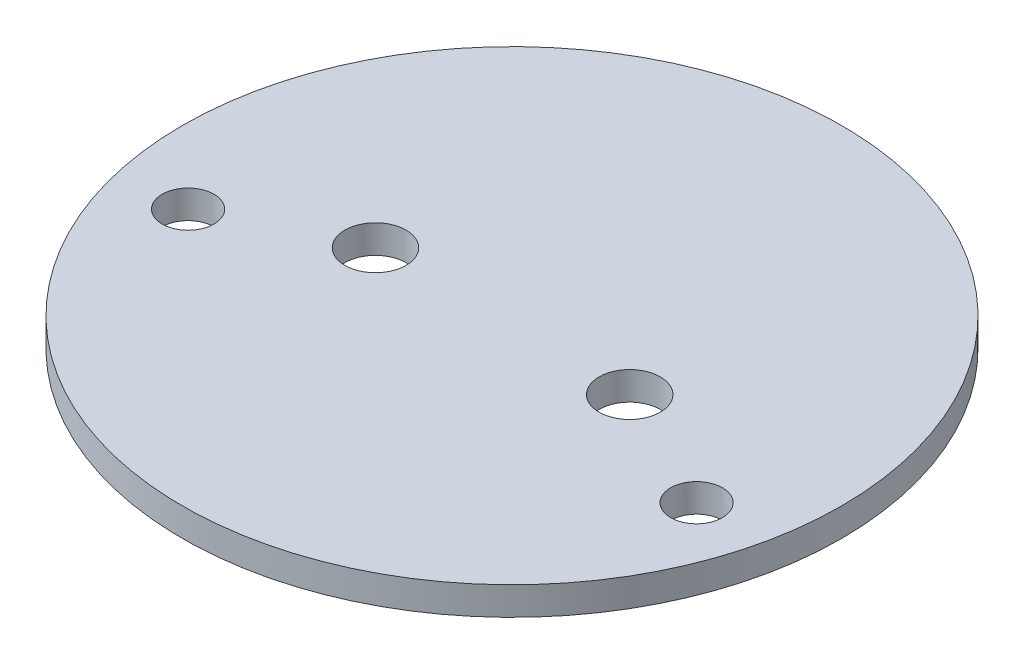
ISO-10303-21;
HEADER;
FILE_DESCRIPTION(('STEP AP214'),'2;1');
FILE_NAME('part.step','',(''),(''),'','','');
FILE_SCHEMA(('AUTOMOTIVE_DESIGN { 1 0 10303 214 1 1 1 1 }'));
ENDSEC;
DATA;
#1=APPLICATION_CONTEXT('core data for automotive mechanical design processes');
#2=APPLICATION_PROTOCOL_DEFINITION('international standard','automotive_design',2000,#1);
#3=PRODUCT_CONTEXT('',#1,'mechanical');
#4=PRODUCT('Part','Part','',(#3));
#5=PRODUCT_RELATED_PRODUCT_CATEGORY('part','',(#4));
#6=PRODUCT_DEFINITION_FORMATION('','',#4);
#7=PRODUCT_DEFINITION_CONTEXT('part definition',#1,'design');
#8=PRODUCT_DEFINITION('design','',#6,#7);
#9=PRODUCT_DEFINITION_SHAPE('','',#8);
#10=(LENGTH_UNIT() NAMED_UNIT(*) SI_UNIT(.MILLI.,.METRE.));
#11=(NAMED_UNIT(*) PLANE_ANGLE_UNIT() SI_UNIT($,.RADIAN.));
#12=(NAMED_UNIT(*) SI_UNIT($,.STERADIAN.) SOLID_ANGLE_UNIT());
#13=UNCERTAINTY_MEASURE_WITH_UNIT(LENGTH_MEASURE(1.E-05),#10,'distance_accuracy_value','');
#14=(GEOMETRIC_REPRESENTATION_CONTEXT(3) GLOBAL_UNCERTAINTY_ASSIGNED_CONTEXT((#13)) GLOBAL_UNIT_ASSIGNED_CONTEXT((#10,
#11,#12)) REPRESENTATION_CONTEXT('',''));
#15=CARTESIAN_POINT('',(0.,0.,0.));
#16=DIRECTION('',(0.,0.,1.));
#17=DIRECTION('',(1.,0.,0.));
#18=AXIS2_PLACEMENT_3D('',#15,#16,#17);
#19=CARTESIAN_POINT('',(0.,0.,0.));
#20=DIRECTION('',(0.,-1.,0.));
#21=DIRECTION('',(1.,0.,0.));
#22=AXIS2_PLACEMENT_3D('',#19,#20,#21);
#23=PLANE('',#22);
#24=CARTESIAN_POINT('',(-27.,-1.52646136765302E-13,7.4));
#25=DIRECTION('',(0.,-1.,0.));
#26=DIRECTION('',(1.,0.,0.));
#27=AXIS2_PLACEMENT_3D('',#24,#25,#26);
#28=CIRCLE('',#27,2.75);
#29=CARTESIAN_POINT('',(-24.25,-1.43212952018367E-13,7.4));
#30=VERTEX_POINT('',#29);
#31=EDGE_CURVE('E81',#30,#30,#28,.F.);
#32=ORIENTED_EDGE('',*,*,#31,.T.);
#33=EDGE_LOOP('',(#32));
#34=FACE_BOUND('',#33,.T.);
#35=CARTESIAN_POINT('',(27.,0.,7.4));
#36=DIRECTION('',(0.,-1.,0.));
#37=DIRECTION('',(1.,0.,0.));
#38=AXIS2_PLACEMENT_3D('',#35,#36,#37);
#39=CIRCLE('',#38,2.75);
#40=CARTESIAN_POINT('',(29.75,0.,7.4));
#41=VERTEX_POINT('',#40);
#42=EDGE_CURVE('E77',#41,#41,#39,.F.);
#43=ORIENTED_EDGE('',*,*,#42,.T.);
#44=EDGE_LOOP('',(#43));
#45=FACE_BOUND('',#44,.T.);
#46=CARTESIAN_POINT('',(-13.5,-1.06337786747726E-13,1.));
#47=DIRECTION('',(0.,-1.,0.));
#48=DIRECTION('',(1.,0.,0.));
#49=AXIS2_PLACEMENT_3D('',#46,#47,#48);
#50=CIRCLE('',#49,3.25);
#51=CARTESIAN_POINT('',(-16.75,-1.1748622264125E-13,1.));
#52=VERTEX_POINT('',#51);
#53=EDGE_CURVE('E58',#52,#52,#50,.F.);
#54=ORIENTED_EDGE('',*,*,#53,.T.);
#55=EDGE_LOOP('',(#54));
#56=FACE_BOUND('',#55,.T.);
#57=CARTESIAN_POINT('',(13.5,0.,1.));
#58=DIRECTION('',(0.,-1.,0.));
#59=DIRECTION('',(1.,0.,0.));
#60=AXIS2_PLACEMENT_3D('',#57,#58,#59);
#61=CIRCLE('',#60,3.25000000000001);
#62=CARTESIAN_POINT('',(10.25,0.,1.));
#63=VERTEX_POINT('',#62);
#64=EDGE_CURVE('E65',#63,#63,#61,.F.);
#65=ORIENTED_EDGE('',*,*,#64,.T.);
#66=EDGE_LOOP('',(#65));
#67=FACE_BOUND('',#66,.T.);
#68=CARTESIAN_POINT('',(0.,-1.11022302462516E-13,0.));
#69=DIRECTION('',(0.,-1.,0.));
#70=DIRECTION('',(1.,0.,0.));
#71=AXIS2_PLACEMENT_3D('',#68,#69,#70);
#72=CIRCLE('',#71,35.);
#73=CARTESIAN_POINT('',(35.,0.,0.));
#74=VERTEX_POINT('',#73);
#75=EDGE_CURVE('E10',#74,#74,#72,.T.);
#76=ORIENTED_EDGE('',*,*,#75,.T.);
#77=EDGE_LOOP('',(#76));
#78=FACE_BOUND('',#77,.T.);
#79=ADVANCED_FACE('F41',(#34,#45,#56,#67,#78),#23,.T.);
#80=CARTESIAN_POINT('',(1.43079862251878E-12,-417.112175525316,0.));
#81=DIRECTION('',(0.,-1.,0.));
#82=DIRECTION('',(1.,0.,0.));
#83=AXIS2_PLACEMENT_3D('',#80,#81,#82);
#84=CYLINDRICAL_SURFACE('',#83,35.);
#85=CARTESIAN_POINT('',(0.,2.99999999999989,0.));
#86=DIRECTION('',(0.,-1.,0.));
#87=DIRECTION('',(1.,0.,0.));
#88=AXIS2_PLACEMENT_3D('',#85,#86,#87);
#89=CIRCLE('',#88,35.);
#90=CARTESIAN_POINT('',(35.,3.00000000000001,0.));
#91=VERTEX_POINT('',#90);
#92=EDGE_CURVE('E48',#91,#91,#89,.T.);
#93=ORIENTED_EDGE('',*,*,#92,.T.);
#94=EDGE_LOOP('',(#93));
#95=FACE_BOUND('',#94,.T.);
#96=ORIENTED_EDGE('',*,*,#75,.F.);
#97=EDGE_LOOP('',(#96));
#98=FACE_BOUND('',#97,.T.);
#99=ADVANCED_FACE('F95',(#95,#98),#84,.T.);
#100=CARTESIAN_POINT('',(35.,3.00000000000006,0.));
#101=DIRECTION('',(0.,1.,0.));
#102=DIRECTION('',(-1.,0.,0.));
#103=AXIS2_PLACEMENT_3D('',#100,#101,#102);
#104=PLANE('',#103);
#105=CARTESIAN_POINT('',(-27.,2.99999999999985,7.4));
#106=DIRECTION('',(0.,1.,0.));
#107=DIRECTION('',(-1.,0.,0.));
#108=AXIS2_PLACEMENT_3D('',#105,#106,#107);
#109=CIRCLE('',#108,2.75);
#110=CARTESIAN_POINT('',(-29.75,2.99999999999984,7.4));
#111=VERTEX_POINT('',#110);
#112=EDGE_CURVE('E66',#111,#111,#109,.T.);
#113=ORIENTED_EDGE('',*,*,#112,.F.);
#114=EDGE_LOOP('',(#113));
#115=FACE_BOUND('',#114,.T.);
#116=CARTESIAN_POINT('',(27.,3.00000000000003,7.4));
#117=DIRECTION('',(0.,1.,0.));
#118=DIRECTION('',(-1.,0.,0.));
#119=AXIS2_PLACEMENT_3D('',#116,#117,#118);
#120=CIRCLE('',#119,2.75);
#121=CARTESIAN_POINT('',(24.25,3.00000000000002,7.4));
#122=VERTEX_POINT('',#121);
#123=EDGE_CURVE('E73',#122,#122,#120,.T.);
#124=ORIENTED_EDGE('',*,*,#123,.F.);
#125=EDGE_LOOP('',(#124));
#126=FACE_BOUND('',#125,.T.);
#127=CARTESIAN_POINT('',(-13.5,2.99999999999989,1.));
#128=DIRECTION('',(0.,1.,0.));
#129=DIRECTION('',(-1.,0.,0.));
#130=AXIS2_PLACEMENT_3D('',#127,#128,#129);
#131=CIRCLE('',#130,3.25);
#132=CARTESIAN_POINT('',(-16.75,2.99999999999988,1.));
#133=VERTEX_POINT('',#132);
#134=EDGE_CURVE('E53',#133,#133,#131,.T.);
#135=ORIENTED_EDGE('',*,*,#134,.F.);
#136=EDGE_LOOP('',(#135));
#137=FACE_BOUND('',#136,.T.);
#138=CARTESIAN_POINT('',(13.5,2.99999999999998,1.));
#139=DIRECTION('',(0.,1.,0.));
#140=DIRECTION('',(-1.,0.,0.));
#141=AXIS2_PLACEMENT_3D('',#138,#139,#140);
#142=CIRCLE('',#141,3.25000000000001);
#143=CARTESIAN_POINT('',(10.25,2.99999999999997,1.));
#144=VERTEX_POINT('',#143);
#145=EDGE_CURVE('E61',#144,#144,#142,.T.);
#146=ORIENTED_EDGE('',*,*,#145,.F.);
#147=EDGE_LOOP('',(#146));
#148=FACE_BOUND('',#147,.T.);
#149=ORIENTED_EDGE('',*,*,#92,.F.);
#150=EDGE_LOOP('',(#149));
#151=FACE_BOUND('',#150,.T.);
#152=ADVANCED_FACE('F91',(#115,#126,#137,#148,#151),#104,.T.);
#153=CARTESIAN_POINT('',(13.5,-0.00100000000006432,1.));
#154=DIRECTION('',(0.,1.,0.));
#155=DIRECTION('',(-1.,0.,0.));
#156=AXIS2_PLACEMENT_3D('',#153,#154,#155);
#157=CYLINDRICAL_SURFACE('',#156,3.25000000000001);
#158=CARTESIAN_POINT('',(10.25,0.,1.));
#159=CARTESIAN_POINT('',(10.25,0.0312499999999751,1.));
#160=CARTESIAN_POINT('',(10.25,0.0624999999999751,1.));
#161=CARTESIAN_POINT('',(10.25,0.124999999999975,1.));
#162=CARTESIAN_POINT('',(10.25,0.156249999999975,1.));
#163=CARTESIAN_POINT('',(10.25,0.218749999999975,1.));
#164=CARTESIAN_POINT('',(10.25,0.249999999999975,1.));
#165=CARTESIAN_POINT('',(10.25,0.312499999999975,1.));
#166=CARTESIAN_POINT('',(10.25,0.343749999999975,1.));
#167=CARTESIAN_POINT('',(10.25,0.406249999999975,1.));
#168=CARTESIAN_POINT('',(10.25,0.437499999999975,1.));
#169=CARTESIAN_POINT('',(10.25,0.499999999999975,1.));
#170=CARTESIAN_POINT('',(10.25,0.531249999999975,1.));
#171=CARTESIAN_POINT('',(10.25,0.593749999999975,1.));
#172=CARTESIAN_POINT('',(10.25,0.624999999999975,1.));
#173=CARTESIAN_POINT('',(10.25,0.687499999999975,1.));
#174=CARTESIAN_POINT('',(10.25,0.718749999999974,1.));
#175=CARTESIAN_POINT('',(10.25,0.781249999999975,1.));
#176=CARTESIAN_POINT('',(10.25,0.812499999999974,1.));
#177=CARTESIAN_POINT('',(10.25,0.874999999999975,1.));
#178=CARTESIAN_POINT('',(10.25,0.906249999999974,1.));
#179=CARTESIAN_POINT('',(10.25,0.968749999999974,1.));
#180=CARTESIAN_POINT('',(10.25,0.999999999999974,1.));
#181=CARTESIAN_POINT('',(10.25,1.06249999999997,1.));
#182=CARTESIAN_POINT('',(10.25,1.09374999999997,1.));
#183=CARTESIAN_POINT('',(10.25,1.15624999999997,1.));
#184=CARTESIAN_POINT('',(10.25,1.18749999999997,1.));
#185=CARTESIAN_POINT('',(10.25,1.24999999999997,1.));
#186=CARTESIAN_POINT('',(10.25,1.28124999999997,1.));
#187=CARTESIAN_POINT('',(10.25,1.34374999999997,1.));
#188=CARTESIAN_POINT('',(10.25,1.37499999999997,1.));
#189=CARTESIAN_POINT('',(10.25,1.43749999999997,1.));
#190=CARTESIAN_POINT('',(10.25,1.46874999999997,1.));
#191=CARTESIAN_POINT('',(10.25,1.53124999999997,1.));
#192=CARTESIAN_POINT('',(10.25,1.56249999999997,1.));
#193=CARTESIAN_POINT('',(10.25,1.62499999999997,1.));
#194=CARTESIAN_POINT('',(10.25,1.65624999999997,1.));
#195=CARTESIAN_POINT('',(10.25,1.71874999999997,1.));
#196=CARTESIAN_POINT('',(10.25,1.74999999999997,1.));
#197=CARTESIAN_POINT('',(10.25,1.81249999999997,1.));
#198=CARTESIAN_POINT('',(10.25,1.84374999999997,1.));
#199=CARTESIAN_POINT('',(10.25,1.90624999999997,1.));
#200=CARTESIAN_POINT('',(10.25,1.93749999999997,1.));
#201=CARTESIAN_POINT('',(10.25,1.99999999999997,1.));
#202=CARTESIAN_POINT('',(10.25,2.03124999999997,1.));
#203=CARTESIAN_POINT('',(10.25,2.09374999999997,1.));
#204=CARTESIAN_POINT('',(10.25,2.12499999999997,1.));
#205=CARTESIAN_POINT('',(10.25,2.18749999999997,1.));
#206=CARTESIAN_POINT('',(10.25,2.21874999999997,1.));
#207=CARTESIAN_POINT('',(10.25,2.28124999999997,1.));
#208=CARTESIAN_POINT('',(10.25,2.31249999999997,1.));
#209=CARTESIAN_POINT('',(10.25,2.37499999999997,1.));
#210=CARTESIAN_POINT('',(10.25,2.40624999999997,1.));
#211=CARTESIAN_POINT('',(10.25,2.46874999999997,1.));
#212=CARTESIAN_POINT('',(10.25,2.49999999999997,1.));
#213=CARTESIAN_POINT('',(10.25,2.56249999999997,1.));
#214=CARTESIAN_POINT('',(10.25,2.59374999999997,1.));
#215=CARTESIAN_POINT('',(10.25,2.65624999999997,1.));
#216=CARTESIAN_POINT('',(10.25,2.68749999999997,1.));
#217=CARTESIAN_POINT('',(10.25,2.74999999999997,1.));
#218=CARTESIAN_POINT('',(10.25,2.78124999999997,1.));
#219=CARTESIAN_POINT('',(10.25,2.84374999999997,1.));
#220=CARTESIAN_POINT('',(10.25,2.87499999999997,1.));
#221=CARTESIAN_POINT('',(10.25,2.93749999999997,1.));
#222=CARTESIAN_POINT('',(10.25,2.96874999999997,1.));
#223=CARTESIAN_POINT('',(10.25,2.99999999999997,1.));
#224=B_SPLINE_CURVE_WITH_KNOTS('',3,(#158,#159,#160,#161,#162,#163,#164,#165,#166,#167,#168,
#169,#170,#171,#172,#173,#174,#175,#176,#177,#178,#179,#180,#181,#182,#183,#184,#185,#186,#187,
#188,#189,#190,#191,#192,#193,#194,#195,#196,#197,#198,#199,#200,#201,#202,#203,#204,#205,#206,
#207,#208,#209,#210,#211,#212,#213,#214,#215,#216,#217,#218,#219,#220,#221,#222,#223),
.UNSPECIFIED.,.F.,.F.,(4,2,2,2,2,2,2,2,2,2,2,2,2,2,2,2,2,2,2,2,2,2,2,2,2,2,2,2,2,2,2,2,4),(0.,
0.0937499999999999,0.1875,0.28125,0.375,0.46875,0.562499999999999,0.656249999999999,
0.749999999999999,0.843749999999999,0.937499999999999,1.03125,1.125,1.21875,1.3125,1.40625,1.5,
1.59375,1.6875,1.78125,1.875,1.96875,2.0625,2.15625,2.25,2.34375,2.4375,2.53125,2.625,2.71875,
2.8125,2.90625,3.),.UNSPECIFIED.);
#225=EDGE_CURVE('BSEAM94',#63,#144,#224,.T.);
#226=ORIENTED_EDGE('',*,*,#64,.F.);
#227=ORIENTED_EDGE('',*,*,#145,.T.);
#228=ORIENTED_EDGE('',*,*,#225,.T.);
#229=ORIENTED_EDGE('',*,*,#225,.F.);
#230=EDGE_LOOP('',(#226,#228,#227,#229));
#231=FACE_BOUND('',#230,.T.);
#232=ADVANCED_FACE('F94',(#231),#157,.F.);
#233=CARTESIAN_POINT('',(-13.5,-0.00100000000015713,1.));
#234=DIRECTION('',(0.,1.,0.));
#235=DIRECTION('',(-1.,0.,0.));
#236=AXIS2_PLACEMENT_3D('',#233,#234,#235);
#237=CYLINDRICAL_SURFACE('',#236,3.25);
#238=CARTESIAN_POINT('',(-16.75,-1.1748622264125E-13,1.));
#239=CARTESIAN_POINT('',(-16.75,0.0312499999998825,1.));
#240=CARTESIAN_POINT('',(-16.75,0.0624999999998825,1.));
#241=CARTESIAN_POINT('',(-16.75,0.124999999999882,1.));
#242=CARTESIAN_POINT('',(-16.75,0.156249999999882,1.));
#243=CARTESIAN_POINT('',(-16.75,0.218749999999882,1.));
#244=CARTESIAN_POINT('',(-16.75,0.249999999999882,1.));
#245=CARTESIAN_POINT('',(-16.75,0.312499999999882,1.));
#246=CARTESIAN_POINT('',(-16.75,0.343749999999882,1.));
#247=CARTESIAN_POINT('',(-16.75,0.406249999999882,1.));
#248=CARTESIAN_POINT('',(-16.75,0.437499999999882,1.));
#249=CARTESIAN_POINT('',(-16.75,0.499999999999882,1.));
#250=CARTESIAN_POINT('',(-16.75,0.531249999999882,1.));
#251=CARTESIAN_POINT('',(-16.75,0.593749999999882,1.));
#252=CARTESIAN_POINT('',(-16.75,0.624999999999882,1.));
#253=CARTESIAN_POINT('',(-16.75,0.687499999999882,1.));
#254=CARTESIAN_POINT('',(-16.75,0.718749999999882,1.));
#255=CARTESIAN_POINT('',(-16.75,0.781249999999882,1.));
#256=CARTESIAN_POINT('',(-16.75,0.812499999999882,1.));
#257=CARTESIAN_POINT('',(-16.75,0.874999999999882,1.));
#258=CARTESIAN_POINT('',(-16.75,0.906249999999882,1.));
#259=CARTESIAN_POINT('',(-16.75,0.968749999999882,1.));
#260=CARTESIAN_POINT('',(-16.75,0.999999999999882,1.));
#261=CARTESIAN_POINT('',(-16.75,1.06249999999988,1.));
#262=CARTESIAN_POINT('',(-16.75,1.09374999999988,1.));
#263=CARTESIAN_POINT('',(-16.75,1.15624999999988,1.));
#264=CARTESIAN_POINT('',(-16.75,1.18749999999988,1.));
#265=CARTESIAN_POINT('',(-16.75,1.24999999999988,1.));
#266=CARTESIAN_POINT('',(-16.75,1.28124999999988,1.));
#267=CARTESIAN_POINT('',(-16.75,1.34374999999988,1.));
#268=CARTESIAN_POINT('',(-16.75,1.37499999999988,1.));
#269=CARTESIAN_POINT('',(-16.75,1.43749999999988,1.));
#270=CARTESIAN_POINT('',(-16.75,1.46874999999988,1.));
#271=CARTESIAN_POINT('',(-16.75,1.53124999999988,1.));
#272=CARTESIAN_POINT('',(-16.75,1.56249999999988,1.));
#273=CARTESIAN_POINT('',(-16.75,1.62499999999988,1.));
#274=CARTESIAN_POINT('',(-16.75,1.65624999999988,1.));
#275=CARTESIAN_POINT('',(-16.75,1.71874999999988,1.));
#276=CARTESIAN_POINT('',(-16.75,1.74999999999988,1.));
#277=CARTESIAN_POINT('',(-16.75,1.81249999999988,1.));
#278=CARTESIAN_POINT('',(-16.75,1.84374999999988,1.));
#279=CARTESIAN_POINT('',(-16.75,1.90624999999988,1.));
#280=CARTESIAN_POINT('',(-16.75,1.93749999999988,1.));
#281=CARTESIAN_POINT('',(-16.75,1.99999999999988,1.));
#282=CARTESIAN_POINT('',(-16.75,2.03124999999988,1.));
#283=CARTESIAN_POINT('',(-16.75,2.09374999999988,1.));
#284=CARTESIAN_POINT('',(-16.75,2.12499999999988,1.));
#285=CARTESIAN_POINT('',(-16.75,2.18749999999988,1.));
#286=CARTESIAN_POINT('',(-16.75,2.21874999999988,1.));
#287=CARTESIAN_POINT('',(-16.75,2.28124999999988,1.));
#288=CARTESIAN_POINT('',(-16.75,2.31249999999988,1.));
#289=CARTESIAN_POINT('',(-16.75,2.37499999999988,1.));
#290=CARTESIAN_POINT('',(-16.75,2.40624999999988,1.));
#291=CARTESIAN_POINT('',(-16.75,2.46874999999988,1.));
#292=CARTESIAN_POINT('',(-16.75,2.49999999999988,1.));
#293=CARTESIAN_POINT('',(-16.75,2.56249999999988,1.));
#294=CARTESIAN_POINT('',(-16.75,2.59374999999988,1.));
#295=CARTESIAN_POINT('',(-16.75,2.65624999999988,1.));
#296=CARTESIAN_POINT('',(-16.75,2.68749999999988,1.));
#297=CARTESIAN_POINT('',(-16.75,2.74999999999988,1.));
#298=CARTESIAN_POINT('',(-16.75,2.78124999999988,1.));
#299=CARTESIAN_POINT('',(-16.75,2.84374999999988,1.));
#300=CARTESIAN_POINT('',(-16.75,2.87499999999988,1.));
#301=CARTESIAN_POINT('',(-16.75,2.93749999999988,1.));
#302=CARTESIAN_POINT('',(-16.75,2.96874999999988,1.));
#303=CARTESIAN_POINT('',(-16.75,2.99999999999988,1.));
#304=B_SPLINE_CURVE_WITH_KNOTS('',3,(#238,#239,#240,#241,#242,#243,#244,#245,#246,#247,#248,
#249,#250,#251,#252,#253,#254,#255,#256,#257,#258,#259,#260,#261,#262,#263,#264,#265,#266,#267,
#268,#269,#270,#271,#272,#273,#274,#275,#276,#277,#278,#279,#280,#281,#282,#283,#284,#285,#286,
#287,#288,#289,#290,#291,#292,#293,#294,#295,#296,#297,#298,#299,#300,#301,#302,#303),
.UNSPECIFIED.,.F.,.F.,(4,2,2,2,2,2,2,2,2,2,2,2,2,2,2,2,2,2,2,2,2,2,2,2,2,2,2,2,2,2,2,2,4),(0.,
0.0937499999999999,0.1875,0.28125,0.375,0.46875,0.562499999999999,0.656249999999999,
0.749999999999999,0.843749999999999,0.937499999999999,1.03125,1.125,1.21875,1.3125,1.40625,1.5,
1.59375,1.6875,1.78125,1.875,1.96875,2.0625,2.15625,2.25,2.34375,2.4375,2.53125,2.625,2.71875,
2.8125,2.90625,3.),.UNSPECIFIED.);
#305=EDGE_CURVE('BSEAM105',#52,#133,#304,.T.);
#306=ORIENTED_EDGE('',*,*,#53,.F.);
#307=ORIENTED_EDGE('',*,*,#134,.T.);
#308=ORIENTED_EDGE('',*,*,#305,.T.);
#309=ORIENTED_EDGE('',*,*,#305,.F.);
#310=EDGE_LOOP('',(#306,#308,#307,#309));
#311=FACE_BOUND('',#310,.T.);
#312=ADVANCED_FACE('F105',(#311),#237,.F.);
#313=CARTESIAN_POINT('',(27.,-0.001000000000122,7.4));
#314=DIRECTION('',(0.,1.,0.));
#315=DIRECTION('',(-1.,0.,0.));
#316=AXIS2_PLACEMENT_3D('',#313,#314,#315);
#317=CYLINDRICAL_SURFACE('',#316,2.75);
#318=ORIENTED_EDGE('',*,*,#42,.F.);
#319=EDGE_LOOP('',(#318));
#320=FACE_BOUND('',#319,.T.);
#321=ORIENTED_EDGE('',*,*,#123,.T.);
#322=EDGE_LOOP('',(#321));
#323=FACE_BOUND('',#322,.T.);
#324=ADVANCED_FACE('F111',(#320,#323),#317,.F.);
#325=CARTESIAN_POINT('',(-27.,-0.00100000000030761,7.4));
#326=DIRECTION('',(0.,1.,0.));
#327=DIRECTION('',(-1.,0.,0.));
#328=AXIS2_PLACEMENT_3D('',#325,#326,#327);
#329=CYLINDRICAL_SURFACE('',#328,2.75);
#330=ORIENTED_EDGE('',*,*,#31,.F.);
#331=EDGE_LOOP('',(#330));
#332=FACE_BOUND('',#331,.T.);
#333=ORIENTED_EDGE('',*,*,#112,.T.);
#334=EDGE_LOOP('',(#333));
#335=FACE_BOUND('',#334,.T.);
#336=ADVANCED_FACE('F89',(#332,#335),#329,.F.);
#337=CLOSED_SHELL('',(#79,#99,#152,#232,#312,#324,#336));
#338=MANIFOLD_SOLID_BREP('B2',#337);
#339=ADVANCED_BREP_SHAPE_REPRESENTATION('',(#18,#338),#14);
#340=SHAPE_DEFINITION_REPRESENTATION(#9,#339);
ENDSEC;
END-ISO-10303-21;
